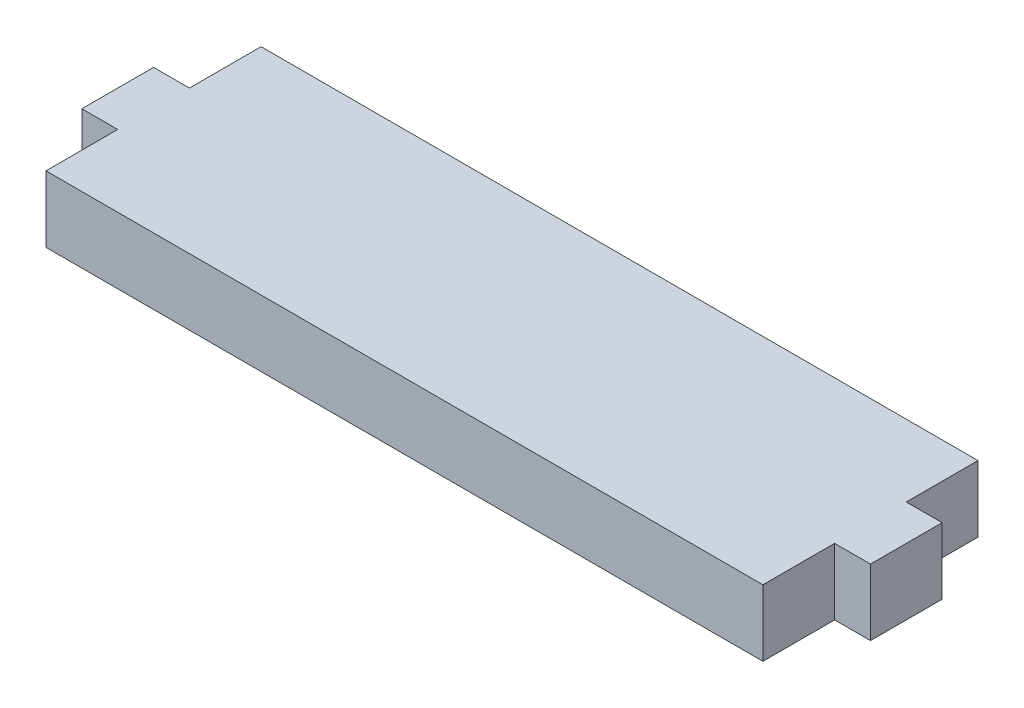
ISO-10303-21;
HEADER;
FILE_DESCRIPTION(('STEP AP214'),'2;1');
FILE_NAME('part.step','',(''),(''),'','','');
FILE_SCHEMA(('AUTOMOTIVE_DESIGN { 1 0 10303 214 1 1 1 1 }'));
ENDSEC;
DATA;
#1=APPLICATION_CONTEXT('core data for automotive mechanical design processes');
#2=APPLICATION_PROTOCOL_DEFINITION('international standard','automotive_design',2000,#1);
#3=PRODUCT_CONTEXT('',#1,'mechanical');
#4=PRODUCT('Part','Part','',(#3));
#5=PRODUCT_RELATED_PRODUCT_CATEGORY('part','',(#4));
#6=PRODUCT_DEFINITION_FORMATION('','',#4);
#7=PRODUCT_DEFINITION_CONTEXT('part definition',#1,'design');
#8=PRODUCT_DEFINITION('design','',#6,#7);
#9=PRODUCT_DEFINITION_SHAPE('','',#8);
#10=(LENGTH_UNIT() NAMED_UNIT(*) SI_UNIT(.MILLI.,.METRE.));
#11=(NAMED_UNIT(*) PLANE_ANGLE_UNIT() SI_UNIT($,.RADIAN.));
#12=(NAMED_UNIT(*) SI_UNIT($,.STERADIAN.) SOLID_ANGLE_UNIT());
#13=UNCERTAINTY_MEASURE_WITH_UNIT(LENGTH_MEASURE(1.E-05),#10,'distance_accuracy_value','');
#14=(GEOMETRIC_REPRESENTATION_CONTEXT(3) GLOBAL_UNCERTAINTY_ASSIGNED_CONTEXT((#13)) GLOBAL_UNIT_ASSIGNED_CONTEXT((#10,
#11,#12)) REPRESENTATION_CONTEXT('',''));
#15=CARTESIAN_POINT('',(0.,0.,0.));
#16=DIRECTION('',(0.,0.,1.));
#17=DIRECTION('',(1.,0.,0.));
#18=AXIS2_PLACEMENT_3D('',#15,#16,#17);
#19=CARTESIAN_POINT('',(-17.3305954210299,3.7,0.));
#20=DIRECTION('',(1.,0.,0.));
#21=DIRECTION('',(0.,0.,-1.));
#22=AXIS2_PLACEMENT_3D('',#19,#20,#21);
#23=PLANE('',#22);
#24=DIRECTION('',(0.,0.,1.));
#25=VECTOR('',#24,1.);
#26=CARTESIAN_POINT('',(-17.3305954210299,0.,0.));
#27=LINE('',#26,#25);
#28=CARTESIAN_POINT('',(-17.3305954210299,0.,-3.40082137369102));
#29=VERTEX_POINT('',#28);
#30=CARTESIAN_POINT('',(-17.3305954210299,0.,0.599178626308984));
#31=VERTEX_POINT('',#30);
#32=EDGE_CURVE('E158',#29,#31,#27,.T.);
#33=ORIENTED_EDGE('',*,*,#32,.T.);
#34=DIRECTION('',(0.,-1.,0.));
#35=VECTOR('',#34,1.);
#36=CARTESIAN_POINT('',(-17.3305954210299,3.7,0.599178626308984));
#37=LINE('',#36,#35);
#38=CARTESIAN_POINT('',(-17.3305954210299,3.7,0.599178626308984));
#39=VERTEX_POINT('',#38);
#40=EDGE_CURVE('E12',#39,#31,#37,.T.);
#41=ORIENTED_EDGE('',*,*,#40,.F.);
#42=DIRECTION('',(0.,0.,1.));
#43=VECTOR('',#42,1.);
#44=CARTESIAN_POINT('',(-17.3305954210299,3.7,0.));
#45=LINE('',#44,#43);
#46=CARTESIAN_POINT('',(-17.3305954210299,3.7,-3.40082137369102));
#47=VERTEX_POINT('',#46);
#48=EDGE_CURVE('E173',#47,#39,#45,.T.);
#49=ORIENTED_EDGE('',*,*,#48,.F.);
#50=DIRECTION('',(0.,-1.,0.));
#51=VECTOR('',#50,1.);
#52=CARTESIAN_POINT('',(-17.3305954210299,3.7,-3.40082137369102));
#53=LINE('',#52,#51);
#54=EDGE_CURVE('E51',#47,#29,#53,.T.);
#55=ORIENTED_EDGE('',*,*,#54,.T.);
#56=EDGE_LOOP('',(#33,#41,#49,#55));
#57=FACE_BOUND('',#56,.T.);
#58=ADVANCED_FACE('F35',(#57),#23,.F.);
#59=CARTESIAN_POINT('',(0.,3.7,0.599178626308984));
#60=DIRECTION('',(0.,0.,-1.));
#61=DIRECTION('',(-1.,0.,0.));
#62=AXIS2_PLACEMENT_3D('',#59,#60,#61);
#63=PLANE('',#62);
#64=DIRECTION('',(1.,0.,0.));
#65=VECTOR('',#64,1.);
#66=CARTESIAN_POINT('',(0.,0.,0.599178626308984));
#67=LINE('',#66,#65);
#68=CARTESIAN_POINT('',(-15.3305954210299,0.,0.599178626308984));
#69=VERTEX_POINT('',#68);
#70=EDGE_CURVE('E160',#31,#69,#67,.T.);
#71=ORIENTED_EDGE('',*,*,#70,.T.);
#72=DIRECTION('',(0.,-1.,0.));
#73=VECTOR('',#72,1.);
#74=CARTESIAN_POINT('',(-15.3305954210299,3.7,0.599178626308984));
#75=LINE('',#74,#73);
#76=CARTESIAN_POINT('',(-15.3305954210299,3.7,0.599178626308984));
#77=VERTEX_POINT('',#76);
#78=EDGE_CURVE('E43',#77,#69,#75,.T.);
#79=ORIENTED_EDGE('',*,*,#78,.F.);
#80=DIRECTION('',(1.,0.,0.));
#81=VECTOR('',#80,1.);
#82=CARTESIAN_POINT('',(0.,3.7,0.599178626308984));
#83=LINE('',#82,#81);
#84=EDGE_CURVE('E102',#39,#77,#83,.T.);
#85=ORIENTED_EDGE('',*,*,#84,.F.);
#86=ORIENTED_EDGE('',*,*,#40,.T.);
#87=EDGE_LOOP('',(#71,#79,#85,#86));
#88=FACE_BOUND('',#87,.T.);
#89=ADVANCED_FACE('F245',(#88),#63,.F.);
#90=CARTESIAN_POINT('',(-15.3305954210299,3.7,0.));
#91=DIRECTION('',(1.,0.,0.));
#92=DIRECTION('',(0.,0.,-1.));
#93=AXIS2_PLACEMENT_3D('',#90,#91,#92);
#94=PLANE('',#93);
#95=DIRECTION('',(0.,0.,1.));
#96=VECTOR('',#95,1.);
#97=CARTESIAN_POINT('',(-15.3305954210299,0.,0.));
#98=LINE('',#97,#96);
#99=CARTESIAN_POINT('',(-15.3305954210299,0.,4.59917862630898));
#100=VERTEX_POINT('',#99);
#101=EDGE_CURVE('E198',#69,#100,#98,.T.);
#102=ORIENTED_EDGE('',*,*,#101,.T.);
#103=DIRECTION('',(0.,-1.,0.));
#104=VECTOR('',#103,1.);
#105=CARTESIAN_POINT('',(-15.3305954210299,3.7,4.59917862630898));
#106=LINE('',#105,#104);
#107=CARTESIAN_POINT('',(-15.3305954210299,3.7,4.59917862630898));
#108=VERTEX_POINT('',#107);
#109=EDGE_CURVE('E190',#108,#100,#106,.T.);
#110=ORIENTED_EDGE('',*,*,#109,.F.);
#111=DIRECTION('',(0.,0.,1.));
#112=VECTOR('',#111,1.);
#113=CARTESIAN_POINT('',(-15.3305954210299,3.7,0.));
#114=LINE('',#113,#112);
#115=EDGE_CURVE('E199',#77,#108,#114,.T.);
#116=ORIENTED_EDGE('',*,*,#115,.F.);
#117=ORIENTED_EDGE('',*,*,#78,.T.);
#118=EDGE_LOOP('',(#102,#110,#116,#117));
#119=FACE_BOUND('',#118,.T.);
#120=ADVANCED_FACE('F196',(#119),#94,.F.);
#121=CARTESIAN_POINT('',(0.,3.7,4.59917862630898));
#122=DIRECTION('',(0.,0.,-1.));
#123=DIRECTION('',(-1.,0.,0.));
#124=AXIS2_PLACEMENT_3D('',#121,#122,#123);
#125=PLANE('',#124);
#126=DIRECTION('',(1.,0.,0.));
#127=VECTOR('',#126,1.);
#128=CARTESIAN_POINT('',(0.,0.,4.59917862630898));
#129=LINE('',#128,#127);
#130=CARTESIAN_POINT('',(24.6694045789701,0.,4.59917862630898));
#131=VERTEX_POINT('',#130);
#132=EDGE_CURVE('E205',#100,#131,#129,.T.);
#133=ORIENTED_EDGE('',*,*,#132,.T.);
#134=DIRECTION('',(0.,-1.,0.));
#135=VECTOR('',#134,1.);
#136=CARTESIAN_POINT('',(24.6694045789701,3.7,4.59917862630898));
#137=LINE('',#136,#135);
#138=CARTESIAN_POINT('',(24.6694045789701,3.7,4.59917862630898));
#139=VERTEX_POINT('',#138);
#140=EDGE_CURVE('E188',#139,#131,#137,.T.);
#141=ORIENTED_EDGE('',*,*,#140,.F.);
#142=DIRECTION('',(1.,0.,0.));
#143=VECTOR('',#142,1.);
#144=CARTESIAN_POINT('',(0.,3.7,4.59917862630898));
#145=LINE('',#144,#143);
#146=EDGE_CURVE('E254',#108,#139,#145,.T.);
#147=ORIENTED_EDGE('',*,*,#146,.F.);
#148=ORIENTED_EDGE('',*,*,#109,.T.);
#149=EDGE_LOOP('',(#133,#141,#147,#148));
#150=FACE_BOUND('',#149,.T.);
#151=ADVANCED_FACE('F287',(#150),#125,.F.);
#152=CARTESIAN_POINT('',(24.6694045789701,3.7,0.));
#153=DIRECTION('',(1.,0.,0.));
#154=DIRECTION('',(0.,0.,-1.));
#155=AXIS2_PLACEMENT_3D('',#152,#153,#154);
#156=PLANE('',#155);
#157=DIRECTION('',(0.,0.,1.));
#158=VECTOR('',#157,1.);
#159=CARTESIAN_POINT('',(24.6694045789701,0.,0.));
#160=LINE('',#159,#158);
#161=CARTESIAN_POINT('',(24.6694045789701,0.,0.599178626308984));
#162=VERTEX_POINT('',#161);
#163=EDGE_CURVE('E206',#162,#131,#160,.T.);
#164=ORIENTED_EDGE('',*,*,#163,.F.);
#165=DIRECTION('',(0.,-1.,0.));
#166=VECTOR('',#165,1.);
#167=CARTESIAN_POINT('',(24.6694045789701,3.7,0.599178626308984));
#168=LINE('',#167,#166);
#169=CARTESIAN_POINT('',(24.6694045789701,3.7,0.599178626308984));
#170=VERTEX_POINT('',#169);
#171=EDGE_CURVE('E186',#170,#162,#168,.T.);
#172=ORIENTED_EDGE('',*,*,#171,.F.);
#173=DIRECTION('',(0.,0.,1.));
#174=VECTOR('',#173,1.);
#175=CARTESIAN_POINT('',(24.6694045789701,3.7,0.));
#176=LINE('',#175,#174);
#177=EDGE_CURVE('E256',#170,#139,#176,.T.);
#178=ORIENTED_EDGE('',*,*,#177,.T.);
#179=ORIENTED_EDGE('',*,*,#140,.T.);
#180=EDGE_LOOP('',(#164,#172,#178,#179));
#181=FACE_BOUND('',#180,.T.);
#182=ADVANCED_FACE('F283',(#181),#156,.T.);
#183=CARTESIAN_POINT('',(0.,3.7,0.599178626308984));
#184=DIRECTION('',(0.,0.,-1.));
#185=DIRECTION('',(-1.,0.,0.));
#186=AXIS2_PLACEMENT_3D('',#183,#184,#185);
#187=PLANE('',#186);
#188=DIRECTION('',(1.,0.,0.));
#189=VECTOR('',#188,1.);
#190=CARTESIAN_POINT('',(0.,0.,0.599178626308984));
#191=LINE('',#190,#189);
#192=CARTESIAN_POINT('',(26.6694045789701,0.,0.599178626308984));
#193=VERTEX_POINT('',#192);
#194=EDGE_CURVE('E217',#162,#193,#191,.T.);
#195=ORIENTED_EDGE('',*,*,#194,.T.);
#196=DIRECTION('',(0.,-1.,0.));
#197=VECTOR('',#196,1.);
#198=CARTESIAN_POINT('',(26.6694045789701,3.7,0.599178626308984));
#199=LINE('',#198,#197);
#200=CARTESIAN_POINT('',(26.6694045789701,3.7,0.599178626308984));
#201=VERTEX_POINT('',#200);
#202=EDGE_CURVE('E184',#201,#193,#199,.T.);
#203=ORIENTED_EDGE('',*,*,#202,.F.);
#204=DIRECTION('',(1.,0.,0.));
#205=VECTOR('',#204,1.);
#206=CARTESIAN_POINT('',(0.,3.7,0.599178626308984));
#207=LINE('',#206,#205);
#208=EDGE_CURVE('E259',#170,#201,#207,.T.);
#209=ORIENTED_EDGE('',*,*,#208,.F.);
#210=ORIENTED_EDGE('',*,*,#171,.T.);
#211=EDGE_LOOP('',(#195,#203,#209,#210));
#212=FACE_BOUND('',#211,.T.);
#213=ADVANCED_FACE('F280',(#212),#187,.F.);
#214=CARTESIAN_POINT('',(26.6694045789701,3.7,0.));
#215=DIRECTION('',(1.,0.,0.));
#216=DIRECTION('',(0.,0.,-1.));
#217=AXIS2_PLACEMENT_3D('',#214,#215,#216);
#218=PLANE('',#217);
#219=DIRECTION('',(0.,0.,1.));
#220=VECTOR('',#219,1.);
#221=CARTESIAN_POINT('',(26.6694045789701,0.,0.));
#222=LINE('',#221,#220);
#223=CARTESIAN_POINT('',(26.6694045789701,0.,-3.40082137369102));
#224=VERTEX_POINT('',#223);
#225=EDGE_CURVE('E221',#224,#193,#222,.T.);
#226=ORIENTED_EDGE('',*,*,#225,.F.);
#227=DIRECTION('',(0.,-1.,0.));
#228=VECTOR('',#227,1.);
#229=CARTESIAN_POINT('',(26.6694045789701,3.7,-3.40082137369102));
#230=LINE('',#229,#228);
#231=CARTESIAN_POINT('',(26.6694045789701,3.7,-3.40082137369102));
#232=VERTEX_POINT('',#231);
#233=EDGE_CURVE('E182',#232,#224,#230,.T.);
#234=ORIENTED_EDGE('',*,*,#233,.F.);
#235=DIRECTION('',(0.,0.,1.));
#236=VECTOR('',#235,1.);
#237=CARTESIAN_POINT('',(26.6694045789701,3.7,0.));
#238=LINE('',#237,#236);
#239=EDGE_CURVE('E261',#232,#201,#238,.T.);
#240=ORIENTED_EDGE('',*,*,#239,.T.);
#241=ORIENTED_EDGE('',*,*,#202,.T.);
#242=EDGE_LOOP('',(#226,#234,#240,#241));
#243=FACE_BOUND('',#242,.T.);
#244=ADVANCED_FACE('F276',(#243),#218,.T.);
#245=CARTESIAN_POINT('',(0.,3.7,-3.40082137369101));
#246=DIRECTION('',(0.,0.,-1.));
#247=DIRECTION('',(-1.,0.,0.));
#248=AXIS2_PLACEMENT_3D('',#245,#246,#247);
#249=PLANE('',#248);
#250=DIRECTION('',(1.,0.,0.));
#251=VECTOR('',#250,1.);
#252=CARTESIAN_POINT('',(0.,0.,-3.40082137369101));
#253=LINE('',#252,#251);
#254=CARTESIAN_POINT('',(24.6694045789701,0.,-3.40082137369102));
#255=VERTEX_POINT('',#254);
#256=EDGE_CURVE('E225',#255,#224,#253,.T.);
#257=ORIENTED_EDGE('',*,*,#256,.F.);
#258=DIRECTION('',(0.,-1.,0.));
#259=VECTOR('',#258,1.);
#260=CARTESIAN_POINT('',(24.6694045789701,3.7,-3.40082137369102));
#261=LINE('',#260,#259);
#262=CARTESIAN_POINT('',(24.6694045789701,3.7,-3.40082137369102));
#263=VERTEX_POINT('',#262);
#264=EDGE_CURVE('E180',#263,#255,#261,.T.);
#265=ORIENTED_EDGE('',*,*,#264,.F.);
#266=DIRECTION('',(1.,0.,0.));
#267=VECTOR('',#266,1.);
#268=CARTESIAN_POINT('',(0.,3.7,-3.40082137369101));
#269=LINE('',#268,#267);
#270=EDGE_CURVE('E153',#263,#232,#269,.T.);
#271=ORIENTED_EDGE('',*,*,#270,.T.);
#272=ORIENTED_EDGE('',*,*,#233,.T.);
#273=EDGE_LOOP('',(#257,#265,#271,#272));
#274=FACE_BOUND('',#273,.T.);
#275=ADVANCED_FACE('F266',(#274),#249,.T.);
#276=CARTESIAN_POINT('',(24.6694045789701,3.7,0.));
#277=DIRECTION('',(1.,0.,0.));
#278=DIRECTION('',(0.,0.,-1.));
#279=AXIS2_PLACEMENT_3D('',#276,#277,#278);
#280=PLANE('',#279);
#281=DIRECTION('',(0.,0.,1.));
#282=VECTOR('',#281,1.);
#283=CARTESIAN_POINT('',(24.6694045789701,0.,0.));
#284=LINE('',#283,#282);
#285=CARTESIAN_POINT('',(24.6694045789701,0.,-7.40082137369102));
#286=VERTEX_POINT('',#285);
#287=EDGE_CURVE('E230',#286,#255,#284,.T.);
#288=ORIENTED_EDGE('',*,*,#287,.F.);
#289=DIRECTION('',(0.,-1.,0.));
#290=VECTOR('',#289,1.);
#291=CARTESIAN_POINT('',(24.6694045789701,3.7,-7.40082137369102));
#292=LINE('',#291,#290);
#293=CARTESIAN_POINT('',(24.6694045789701,3.7,-7.40082137369102));
#294=VERTEX_POINT('',#293);
#295=EDGE_CURVE('E139',#294,#286,#292,.T.);
#296=ORIENTED_EDGE('',*,*,#295,.F.);
#297=DIRECTION('',(0.,0.,1.));
#298=VECTOR('',#297,1.);
#299=CARTESIAN_POINT('',(24.6694045789701,3.7,0.));
#300=LINE('',#299,#298);
#301=EDGE_CURVE('E151',#294,#263,#300,.T.);
#302=ORIENTED_EDGE('',*,*,#301,.T.);
#303=ORIENTED_EDGE('',*,*,#264,.T.);
#304=EDGE_LOOP('',(#288,#296,#302,#303));
#305=FACE_BOUND('',#304,.T.);
#306=ADVANCED_FACE('F271',(#305),#280,.T.);
#307=CARTESIAN_POINT('',(0.,3.7,-7.40082137369101));
#308=DIRECTION('',(0.,0.,-1.));
#309=DIRECTION('',(-1.,0.,0.));
#310=AXIS2_PLACEMENT_3D('',#307,#308,#309);
#311=PLANE('',#310);
#312=DIRECTION('',(1.,0.,0.));
#313=VECTOR('',#312,1.);
#314=CARTESIAN_POINT('',(0.,0.,-7.40082137369101));
#315=LINE('',#314,#313);
#316=CARTESIAN_POINT('',(-15.3305954210299,0.,-7.40082137369101));
#317=VERTEX_POINT('',#316);
#318=EDGE_CURVE('E136',#317,#286,#315,.T.);
#319=ORIENTED_EDGE('',*,*,#318,.F.);
#320=DIRECTION('',(0.,-1.,0.));
#321=VECTOR('',#320,1.);
#322=CARTESIAN_POINT('',(-15.3305954210299,3.7,-7.40082137369101));
#323=LINE('',#322,#321);
#324=CARTESIAN_POINT('',(-15.3305954210299,3.7,-7.40082137369101));
#325=VERTEX_POINT('',#324);
#326=EDGE_CURVE('E130',#325,#317,#323,.T.);
#327=ORIENTED_EDGE('',*,*,#326,.F.);
#328=DIRECTION('',(1.,0.,0.));
#329=VECTOR('',#328,1.);
#330=CARTESIAN_POINT('',(0.,3.7,-7.40082137369101));
#331=LINE('',#330,#329);
#332=EDGE_CURVE('E134',#325,#294,#331,.T.);
#333=ORIENTED_EDGE('',*,*,#332,.T.);
#334=ORIENTED_EDGE('',*,*,#295,.T.);
#335=EDGE_LOOP('',(#319,#327,#333,#334));
#336=FACE_BOUND('',#335,.T.);
#337=ADVANCED_FACE('F132',(#336),#311,.T.);
#338=CARTESIAN_POINT('',(-15.3305954210299,3.7,0.));
#339=DIRECTION('',(1.,0.,0.));
#340=DIRECTION('',(0.,0.,-1.));
#341=AXIS2_PLACEMENT_3D('',#338,#339,#340);
#342=PLANE('',#341);
#343=DIRECTION('',(0.,0.,1.));
#344=VECTOR('',#343,1.);
#345=CARTESIAN_POINT('',(-15.3305954210299,0.,0.));
#346=LINE('',#345,#344);
#347=CARTESIAN_POINT('',(-15.3305954210299,0.,-3.40082137369102));
#348=VERTEX_POINT('',#347);
#349=EDGE_CURVE('E174',#317,#348,#346,.T.);
#350=ORIENTED_EDGE('',*,*,#349,.T.);
#351=DIRECTION('',(0.,-1.,0.));
#352=VECTOR('',#351,1.);
#353=CARTESIAN_POINT('',(-15.3305954210299,3.7,-3.40082137369102));
#354=LINE('',#353,#352);
#355=CARTESIAN_POINT('',(-15.3305954210299,3.7,-3.40082137369102));
#356=VERTEX_POINT('',#355);
#357=EDGE_CURVE('E90',#356,#348,#354,.T.);
#358=ORIENTED_EDGE('',*,*,#357,.F.);
#359=DIRECTION('',(0.,0.,1.));
#360=VECTOR('',#359,1.);
#361=CARTESIAN_POINT('',(-15.3305954210299,3.7,0.));
#362=LINE('',#361,#360);
#363=EDGE_CURVE('E141',#325,#356,#362,.T.);
#364=ORIENTED_EDGE('',*,*,#363,.F.);
#365=ORIENTED_EDGE('',*,*,#326,.T.);
#366=EDGE_LOOP('',(#350,#358,#364,#365));
#367=FACE_BOUND('',#366,.T.);
#368=ADVANCED_FACE('F142',(#367),#342,.F.);
#369=CARTESIAN_POINT('',(0.,3.7,-3.40082137369102));
#370=DIRECTION('',(0.,0.,-1.));
#371=DIRECTION('',(-1.,0.,0.));
#372=AXIS2_PLACEMENT_3D('',#369,#370,#371);
#373=PLANE('',#372);
#374=DIRECTION('',(1.,0.,0.));
#375=VECTOR('',#374,1.);
#376=CARTESIAN_POINT('',(0.,0.,-3.40082137369102));
#377=LINE('',#376,#375);
#378=EDGE_CURVE('E169',#29,#348,#377,.T.);
#379=ORIENTED_EDGE('',*,*,#378,.F.);
#380=ORIENTED_EDGE('',*,*,#54,.F.);
#381=DIRECTION('',(1.,0.,0.));
#382=VECTOR('',#381,1.);
#383=CARTESIAN_POINT('',(0.,3.7,-3.40082137369102));
#384=LINE('',#383,#382);
#385=EDGE_CURVE('E145',#47,#356,#384,.T.);
#386=ORIENTED_EDGE('',*,*,#385,.T.);
#387=ORIENTED_EDGE('',*,*,#357,.T.);
#388=EDGE_LOOP('',(#379,#380,#386,#387));
#389=FACE_BOUND('',#388,.T.);
#390=ADVANCED_FACE('F234',(#389),#373,.T.);
#391=CARTESIAN_POINT('',(0.,3.7,0.));
#392=DIRECTION('',(0.,1.,0.));
#393=DIRECTION('',(0.,0.,1.));
#394=AXIS2_PLACEMENT_3D('',#391,#392,#393);
#395=PLANE('',#394);
#396=ORIENTED_EDGE('',*,*,#48,.T.);
#397=ORIENTED_EDGE('',*,*,#84,.T.);
#398=ORIENTED_EDGE('',*,*,#115,.T.);
#399=ORIENTED_EDGE('',*,*,#146,.T.);
#400=ORIENTED_EDGE('',*,*,#177,.F.);
#401=ORIENTED_EDGE('',*,*,#208,.T.);
#402=ORIENTED_EDGE('',*,*,#239,.F.);
#403=ORIENTED_EDGE('',*,*,#270,.F.);
#404=ORIENTED_EDGE('',*,*,#301,.F.);
#405=ORIENTED_EDGE('',*,*,#332,.F.);
#406=ORIENTED_EDGE('',*,*,#363,.T.);
#407=ORIENTED_EDGE('',*,*,#385,.F.);
#408=EDGE_LOOP('',(#396,#397,#398,#399,#400,#401,#402,#403,#404,#405,#406,#407));
#409=FACE_BOUND('',#408,.T.);
#410=ADVANCED_FACE('F148',(#409),#395,.T.);
#411=CARTESIAN_POINT('',(0.,0.,0.));
#412=DIRECTION('',(0.,1.,0.));
#413=DIRECTION('',(0.,0.,1.));
#414=AXIS2_PLACEMENT_3D('',#411,#412,#413);
#415=PLANE('',#414);
#416=ORIENTED_EDGE('',*,*,#32,.F.);
#417=ORIENTED_EDGE('',*,*,#378,.T.);
#418=ORIENTED_EDGE('',*,*,#349,.F.);
#419=ORIENTED_EDGE('',*,*,#318,.T.);
#420=ORIENTED_EDGE('',*,*,#287,.T.);
#421=ORIENTED_EDGE('',*,*,#256,.T.);
#422=ORIENTED_EDGE('',*,*,#225,.T.);
#423=ORIENTED_EDGE('',*,*,#194,.F.);
#424=ORIENTED_EDGE('',*,*,#163,.T.);
#425=ORIENTED_EDGE('',*,*,#132,.F.);
#426=ORIENTED_EDGE('',*,*,#101,.F.);
#427=ORIENTED_EDGE('',*,*,#70,.F.);
#428=EDGE_LOOP('',(#416,#417,#418,#419,#420,#421,#422,#423,#424,#425,#426,#427));
#429=FACE_BOUND('',#428,.T.);
#430=ADVANCED_FACE('F202',(#429),#415,.F.);
#431=CLOSED_SHELL('',(#58,#89,#120,#151,#182,#213,#244,#275,#306,#337,#368,#390,#410,#430));
#432=MANIFOLD_SOLID_BREP('B2',#431);
#433=ADVANCED_BREP_SHAPE_REPRESENTATION('',(#18,#432),#14);
#434=SHAPE_DEFINITION_REPRESENTATION(#9,#433);
ENDSEC;
END-ISO-10303-21;
